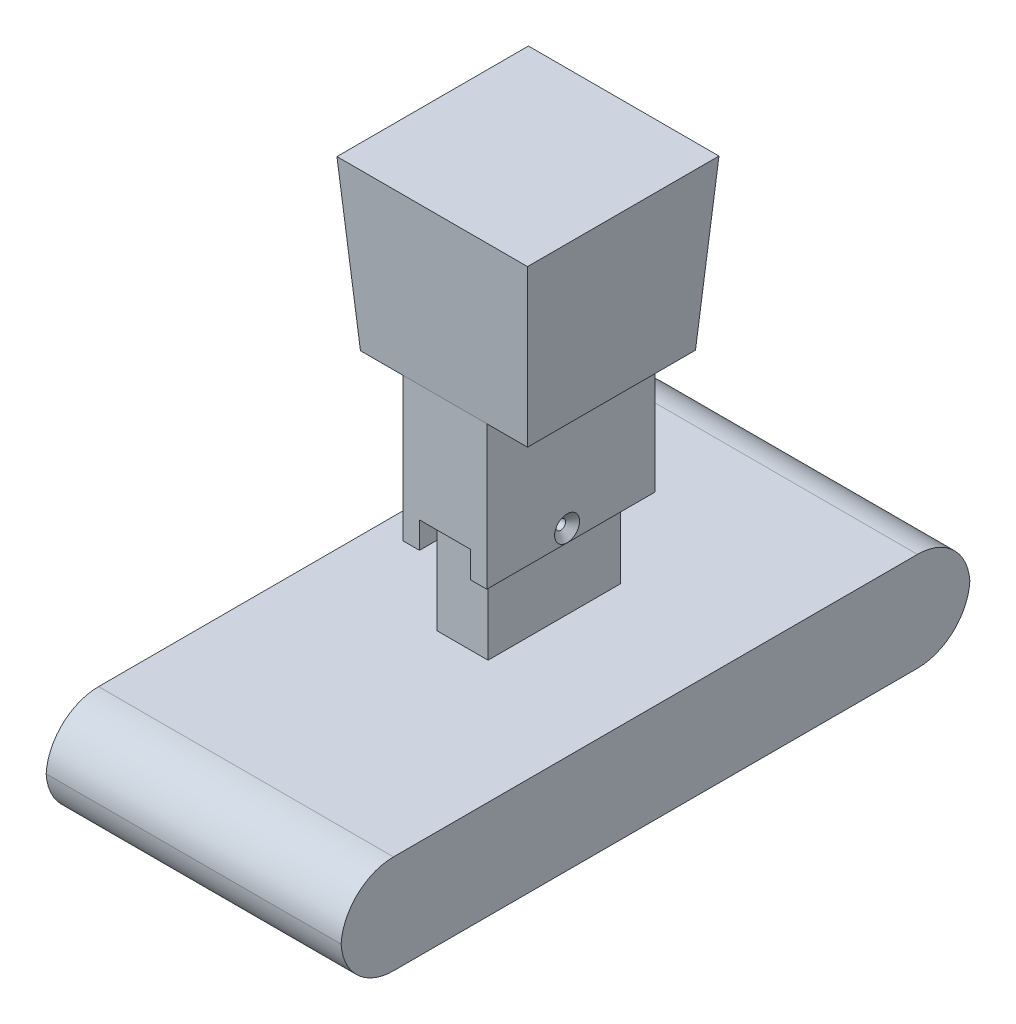
ISO-10303-21;
HEADER;
FILE_DESCRIPTION(('STEP AP214'),'2;1');
FILE_NAME('part.step','',(''),(''),'','','');
FILE_SCHEMA(('AUTOMOTIVE_DESIGN { 1 0 10303 214 1 1 1 1 }'));
ENDSEC;
DATA;
#1=APPLICATION_CONTEXT('core data for automotive mechanical design processes');
#2=APPLICATION_PROTOCOL_DEFINITION('international standard','automotive_design',2000,#1);
#3=PRODUCT_CONTEXT('',#1,'mechanical');
#4=PRODUCT('Part','Part','',(#3));
#5=PRODUCT_RELATED_PRODUCT_CATEGORY('part','',(#4));
#6=PRODUCT_DEFINITION_FORMATION('','',#4);
#7=PRODUCT_DEFINITION_CONTEXT('part definition',#1,'design');
#8=PRODUCT_DEFINITION('design','',#6,#7);
#9=PRODUCT_DEFINITION_SHAPE('','',#8);
#10=(LENGTH_UNIT() NAMED_UNIT(*) SI_UNIT(.MILLI.,.METRE.));
#11=(NAMED_UNIT(*) PLANE_ANGLE_UNIT() SI_UNIT($,.RADIAN.));
#12=(NAMED_UNIT(*) SI_UNIT($,.STERADIAN.) SOLID_ANGLE_UNIT());
#13=UNCERTAINTY_MEASURE_WITH_UNIT(LENGTH_MEASURE(1.E-05),#10,'distance_accuracy_value','');
#14=(GEOMETRIC_REPRESENTATION_CONTEXT(3) GLOBAL_UNCERTAINTY_ASSIGNED_CONTEXT((#13)) GLOBAL_UNIT_ASSIGNED_CONTEXT((#10,
#11,#12)) REPRESENTATION_CONTEXT('',''));
#15=CARTESIAN_POINT('',(0.,0.,0.));
#16=DIRECTION('',(0.,0.,1.));
#17=DIRECTION('',(1.,0.,0.));
#18=AXIS2_PLACEMENT_3D('',#15,#16,#17);
#19=CARTESIAN_POINT('',(-113.089384852017,0.,20.32));
#20=DIRECTION('',(-1.,0.,0.));
#21=DIRECTION('',(0.,0.,1.));
#22=AXIS2_PLACEMENT_3D('',#19,#20,#21);
#23=PLANE('',#22);
#24=DIRECTION('',(0.,1.,0.));
#25=VECTOR('',#24,1.);
#26=CARTESIAN_POINT('',(-113.089384852017,29.0032816792758,2.13819608356187));
#27=LINE('',#26,#25);
#28=CARTESIAN_POINT('',(-113.089384852017,38.5086381309477,2.13819608356187));
#29=VERTEX_POINT('',#28);
#30=CARTESIAN_POINT('',(-113.089384852017,41.7032816792758,2.13819608356187));
#31=VERTEX_POINT('',#30);
#32=EDGE_CURVE('E254',#29,#31,#27,.T.);
#33=ORIENTED_EDGE('',*,*,#32,.F.);
#34=DIRECTION('',(0.,0.,-1.));
#35=VECTOR('',#34,1.);
#36=CARTESIAN_POINT('',(-113.089384852017,38.5086381309477,20.32));
#37=LINE('',#36,#35);
#38=CARTESIAN_POINT('',(-113.089384852017,38.5086381309477,0.));
#39=VERTEX_POINT('',#38);
#40=EDGE_CURVE('E282',#29,#39,#37,.T.);
#41=ORIENTED_EDGE('',*,*,#40,.T.);
#42=DIRECTION('',(0.,1.,0.));
#43=VECTOR('',#42,1.);
#44=CARTESIAN_POINT('',(-113.089384852017,0.,0.));
#45=LINE('',#44,#43);
#46=CARTESIAN_POINT('',(-113.089384852017,41.7032816792758,0.));
#47=VERTEX_POINT('',#46);
#48=EDGE_CURVE('E261',#39,#47,#45,.T.);
#49=ORIENTED_EDGE('',*,*,#48,.T.);
#50=DIRECTION('',(0.,0.,-1.));
#51=VECTOR('',#50,1.);
#52=CARTESIAN_POINT('',(-113.089384852017,41.7032816792758,20.32));
#53=LINE('',#52,#51);
#54=EDGE_CURVE('E271',#31,#47,#53,.T.);
#55=ORIENTED_EDGE('',*,*,#54,.F.);
#56=EDGE_LOOP('',(#33,#41,#49,#55));
#57=FACE_BOUND('',#56,.T.);
#58=ADVANCED_FACE('F36',(#57),#23,.F.);
#59=DIRECTION('',(0.,1.,0.));
#60=VECTOR('',#59,1.);
#61=CARTESIAN_POINT('',(-113.089384852017,29.0032816792758,18.1771981960504));
#62=LINE('',#61,#60);
#63=CARTESIAN_POINT('',(-113.089384852017,38.5086381309477,18.1771981960504));
#64=VERTEX_POINT('',#63);
#65=CARTESIAN_POINT('',(-113.089384852017,41.7032816792758,18.1771981960504));
#66=VERTEX_POINT('',#65);
#67=EDGE_CURVE('E233',#64,#66,#62,.T.);
#68=ORIENTED_EDGE('',*,*,#67,.T.);
#69=CARTESIAN_POINT('',(-113.089384852017,41.7032816792758,20.32));
#70=VERTEX_POINT('',#69);
#71=EDGE_CURVE('E284',#70,#66,#53,.T.);
#72=ORIENTED_EDGE('',*,*,#71,.F.);
#73=DIRECTION('',(0.,1.,0.));
#74=VECTOR('',#73,1.);
#75=CARTESIAN_POINT('',(-113.089384852017,0.,20.32));
#76=LINE('',#75,#74);
#77=CARTESIAN_POINT('',(-113.089384852017,38.5086381309477,20.32));
#78=VERTEX_POINT('',#77);
#79=EDGE_CURVE('E262',#78,#70,#76,.T.);
#80=ORIENTED_EDGE('',*,*,#79,.F.);
#81=EDGE_CURVE('E286',#78,#64,#37,.T.);
#82=ORIENTED_EDGE('',*,*,#81,.T.);
#83=EDGE_LOOP('',(#68,#72,#80,#82));
#84=FACE_BOUND('',#83,.T.);
#85=ADVANCED_FACE('F432',(#84),#23,.F.);
#86=CARTESIAN_POINT('',(-106.938297537199,0.,20.32));
#87=DIRECTION('',(-1.,0.,0.));
#88=DIRECTION('',(0.,0.,1.));
#89=AXIS2_PLACEMENT_3D('',#86,#87,#88);
#90=PLANE('',#89);
#91=DIRECTION('',(0.,0.,-1.));
#92=VECTOR('',#91,1.);
#93=CARTESIAN_POINT('',(-106.938297537199,38.5086381309477,20.32));
#94=LINE('',#93,#92);
#95=CARTESIAN_POINT('',(-106.938297537199,38.5086381309477,2.13819608356187));
#96=VERTEX_POINT('',#95);
#97=CARTESIAN_POINT('',(-106.938297537199,38.5086381309477,0.));
#98=VERTEX_POINT('',#97);
#99=EDGE_CURVE('E289',#96,#98,#94,.T.);
#100=ORIENTED_EDGE('',*,*,#99,.F.);
#101=DIRECTION('',(0.,1.,0.));
#102=VECTOR('',#101,1.);
#103=CARTESIAN_POINT('',(-106.938297537199,29.0032816792758,2.13819608356187));
#104=LINE('',#103,#102);
#105=CARTESIAN_POINT('',(-106.938297537199,41.7032816792758,2.13819608356187));
#106=VERTEX_POINT('',#105);
#107=EDGE_CURVE('E250',#96,#106,#104,.T.);
#108=ORIENTED_EDGE('',*,*,#107,.T.);
#109=DIRECTION('',(0.,0.,-1.));
#110=VECTOR('',#109,1.);
#111=CARTESIAN_POINT('',(-106.938297537199,41.7032816792758,20.32));
#112=LINE('',#111,#110);
#113=CARTESIAN_POINT('',(-106.938297537199,41.7032816792758,0.));
#114=VERTEX_POINT('',#113);
#115=EDGE_CURVE('E283',#106,#114,#112,.T.);
#116=ORIENTED_EDGE('',*,*,#115,.T.);
#117=DIRECTION('',(0.,1.,0.));
#118=VECTOR('',#117,1.);
#119=CARTESIAN_POINT('',(-106.938297537199,0.,0.));
#120=LINE('',#119,#118);
#121=EDGE_CURVE('E266',#98,#114,#120,.T.);
#122=ORIENTED_EDGE('',*,*,#121,.F.);
#123=EDGE_LOOP('',(#100,#108,#116,#122));
#124=FACE_BOUND('',#123,.T.);
#125=ADVANCED_FACE('F438',(#124),#90,.T.);
#126=CARTESIAN_POINT('',(-106.938297537199,41.7032816792758,20.32));
#127=VERTEX_POINT('',#126);
#128=CARTESIAN_POINT('',(-106.938297537199,41.7032816792758,18.1771981960504));
#129=VERTEX_POINT('',#128);
#130=EDGE_CURVE('E279',#127,#129,#112,.T.);
#131=ORIENTED_EDGE('',*,*,#130,.T.);
#132=DIRECTION('',(0.,1.,0.));
#133=VECTOR('',#132,1.);
#134=CARTESIAN_POINT('',(-106.938297537199,29.0032816792758,18.1771981960504));
#135=LINE('',#134,#133);
#136=CARTESIAN_POINT('',(-106.938297537199,38.5086381309477,18.1771981960504));
#137=VERTEX_POINT('',#136);
#138=EDGE_CURVE('E234',#137,#129,#135,.T.);
#139=ORIENTED_EDGE('',*,*,#138,.F.);
#140=CARTESIAN_POINT('',(-106.938297537199,38.5086381309477,20.32));
#141=VERTEX_POINT('',#140);
#142=EDGE_CURVE('E290',#141,#137,#94,.T.);
#143=ORIENTED_EDGE('',*,*,#142,.F.);
#144=DIRECTION('',(0.,1.,0.));
#145=VECTOR('',#144,1.);
#146=CARTESIAN_POINT('',(-106.938297537199,0.,20.32));
#147=LINE('',#146,#145);
#148=EDGE_CURVE('E269',#141,#127,#147,.T.);
#149=ORIENTED_EDGE('',*,*,#148,.T.);
#150=EDGE_LOOP('',(#131,#139,#143,#149));
#151=FACE_BOUND('',#150,.T.);
#152=ADVANCED_FACE('F677',(#151),#90,.T.);
#153=CARTESIAN_POINT('',(0.,41.7032816792758,20.32));
#154=DIRECTION('',(0.,1.,0.));
#155=DIRECTION('',(0.,0.,1.));
#156=AXIS2_PLACEMENT_3D('',#153,#154,#155);
#157=PLANE('',#156);
#158=DIRECTION('',(1.,0.,0.));
#159=VECTOR('',#158,1.);
#160=CARTESIAN_POINT('',(-113.089384852017,41.7032816792758,2.13819608356187));
#161=LINE('',#160,#159);
#162=EDGE_CURVE('E243',#31,#106,#161,.T.);
#163=ORIENTED_EDGE('',*,*,#162,.F.);
#164=ORIENTED_EDGE('',*,*,#54,.T.);
#165=DIRECTION('',(1.,0.,0.));
#166=VECTOR('',#165,1.);
#167=CARTESIAN_POINT('',(0.,41.7032816792758,0.));
#168=LINE('',#167,#166);
#169=EDGE_CURVE('E274',#47,#114,#168,.T.);
#170=ORIENTED_EDGE('',*,*,#169,.T.);
#171=ORIENTED_EDGE('',*,*,#115,.F.);
#172=EDGE_LOOP('',(#163,#164,#170,#171));
#173=FACE_BOUND('',#172,.T.);
#174=ADVANCED_FACE('F442',(#173),#157,.F.);
#175=DIRECTION('',(-1.,0.,0.));
#176=VECTOR('',#175,1.);
#177=CARTESIAN_POINT('',(-113.089384852017,41.7032816792758,18.1771981960504));
#178=LINE('',#177,#176);
#179=EDGE_CURVE('E222',#129,#66,#178,.T.);
#180=ORIENTED_EDGE('',*,*,#179,.F.);
#181=ORIENTED_EDGE('',*,*,#130,.F.);
#182=DIRECTION('',(1.,0.,0.));
#183=VECTOR('',#182,1.);
#184=CARTESIAN_POINT('',(0.,41.7032816792758,20.32));
#185=LINE('',#184,#183);
#186=EDGE_CURVE('E265',#70,#127,#185,.T.);
#187=ORIENTED_EDGE('',*,*,#186,.F.);
#188=ORIENTED_EDGE('',*,*,#71,.T.);
#189=EDGE_LOOP('',(#180,#181,#187,#188));
#190=FACE_BOUND('',#189,.T.);
#191=ADVANCED_FACE('F697',(#190),#157,.F.);
#192=CARTESIAN_POINT('',(-115.084414581043,38.5086381309477,20.32));
#193=DIRECTION('',(0.,1.,0.));
#194=DIRECTION('',(0.,0.,1.));
#195=AXIS2_PLACEMENT_3D('',#192,#193,#194);
#196=PLANE('',#195);
#197=DIRECTION('',(0.,0.,-1.));
#198=VECTOR('',#197,1.);
#199=CARTESIAN_POINT('',(-115.084414581043,38.5086381309477,20.32));
#200=LINE('',#199,#198);
#201=CARTESIAN_POINT('',(-115.084414581043,38.5086381309477,20.32));
#202=VERTEX_POINT('',#201);
#203=CARTESIAN_POINT('',(-115.084414581043,38.5086381309477,10.8353240301669));
#204=VERTEX_POINT('',#203);
#205=EDGE_CURVE('E326',#202,#204,#200,.T.);
#206=ORIENTED_EDGE('',*,*,#205,.T.);
#207=CARTESIAN_POINT('',(-116.579904861221,38.5086381309477,7.67563087085336));
#208=CARTESIAN_POINT('',(-116.531676430921,38.5086381309477,7.74013298126552));
#209=CARTESIAN_POINT('',(-116.483654495705,38.5086381309477,7.80478861527027));
#210=CARTESIAN_POINT('',(-116.388113526813,38.5086381309477,7.93447560651209));
#211=CARTESIAN_POINT('',(-116.340594520505,38.5086381309477,7.99950698390219));
#212=CARTESIAN_POINT('',(-116.19871613225,38.5086381309477,8.19555912378945));
#213=CARTESIAN_POINT('',(-116.105259373255,38.5086381309477,8.32724008149249));
#214=CARTESIAN_POINT('',(-115.965625203916,38.5086381309477,8.52990545343885));
#215=CARTESIAN_POINT('',(-115.918105690399,38.5086381309477,8.59996458844611));
#216=CARTESIAN_POINT('',(-115.824380850821,38.5086381309477,8.74095484776935));
#217=CARTESIAN_POINT('',(-115.778175462128,38.5086381309477,8.81188593029636));
#218=CARTESIAN_POINT('',(-115.687509967517,38.5086381309477,8.95476904816014));
#219=CARTESIAN_POINT('',(-115.643048313018,38.5086381309477,9.02672009663571));
#220=CARTESIAN_POINT('',(-115.556388565981,38.5086381309477,9.17196700307332));
#221=CARTESIAN_POINT('',(-115.514190134147,38.5086381309477,9.24526265723319));
#222=CARTESIAN_POINT('',(-115.433558611727,38.5086381309477,9.39224553137101));
#223=CARTESIAN_POINT('',(-115.395072542976,38.5086381309477,9.4659034418633));
#224=CARTESIAN_POINT('',(-115.3221174564,38.5086381309477,9.61525373900121));
#225=CARTESIAN_POINT('',(-115.287650321112,38.5086381309477,9.69094705880034));
#226=CARTESIAN_POINT('',(-115.224658464418,38.5086381309477,9.84377501740627));
#227=CARTESIAN_POINT('',(-115.196069378831,38.5086381309477,9.92088270803192));
#228=CARTESIAN_POINT('',(-115.146346947675,38.5086381309477,10.0774300876217));
#229=CARTESIAN_POINT('',(-115.125202030043,38.5086381309477,10.1568659472885));
#230=CARTESIAN_POINT('',(-115.10199891339,38.5086381309477,10.2709456209364));
#231=CARTESIAN_POINT('',(-115.095988765363,38.5086381309477,10.3048014618216));
#232=CARTESIAN_POINT('',(-115.085776234085,38.5086381309477,10.3728235600691));
#233=CARTESIAN_POINT('',(-115.081575768524,38.5086381309477,10.4069901077385));
#234=CARTESIAN_POINT('',(-115.073546466467,38.5086381309477,10.4920066641473));
#235=CARTESIAN_POINT('',(-115.070869720658,38.5086381309477,10.5429710584947));
#236=CARTESIAN_POINT('',(-115.069916584298,38.5086381309477,10.6449548681138));
#237=CARTESIAN_POINT('',(-115.071641647297,38.5086381309477,10.6959742959978));
#238=CARTESIAN_POINT('',(-115.079394285956,38.5086381309477,10.7977520469518));
#239=CARTESIAN_POINT('',(-115.085427807555,38.5086381309477,10.8485099114359));
#240=CARTESIAN_POINT('',(-115.10146203058,38.5086381309477,10.9493859653943));
#241=CARTESIAN_POINT('',(-115.1114630687,38.5086381309477,10.9995041002067));
#242=CARTESIAN_POINT('',(-115.142180502623,38.5086381309477,11.1294947105796));
#243=CARTESIAN_POINT('',(-115.165703897389,38.5086381309477,11.2087040792724));
#244=CARTESIAN_POINT('',(-115.219656313533,38.5086381309477,11.3647288228605));
#245=CARTESIAN_POINT('',(-115.250091536832,38.5086381309477,11.4415419768171));
#246=CARTESIAN_POINT('',(-115.316399833669,38.5086381309477,11.5938965101818));
#247=CARTESIAN_POINT('',(-115.352336046426,38.5086381309477,11.6694100438383));
#248=CARTESIAN_POINT('',(-115.409031096902,38.5086381309477,11.7812211922712));
#249=CARTESIAN_POINT('',(-115.428391141939,38.5086381309477,11.8182423904664));
#250=CARTESIAN_POINT('',(-115.467914847167,38.5086381309477,11.8918518174995));
#251=CARTESIAN_POINT('',(-115.488078469607,38.5086381309477,11.9284400665723));
#252=CARTESIAN_POINT('',(-115.559720943907,38.5086381309477,12.0556015744904));
#253=CARTESIAN_POINT('',(-115.6129830929,38.5086381309477,12.1451703266226));
#254=CARTESIAN_POINT('',(-115.722453272709,38.5086381309477,12.3224964311492));
#255=CARTESIAN_POINT('',(-115.778662031617,38.5086381309477,12.4102533283054));
#256=CARTESIAN_POINT('',(-115.893232128843,38.5086381309477,12.5844380401989));
#257=CARTESIAN_POINT('',(-115.951595018128,38.5086381309477,12.6708648312253));
#258=CARTESIAN_POINT('',(-116.069885000815,38.5086381309477,12.8426436038981));
#259=CARTESIAN_POINT('',(-116.129812181147,38.5086381309477,12.9279955254195));
#260=CARTESIAN_POINT('',(-116.311720466465,38.5086381309477,13.1833346103282));
#261=CARTESIAN_POINT('',(-116.435464577521,38.5086381309477,13.352063616011));
#262=CARTESIAN_POINT('',(-116.685714681425,38.5086381309477,13.6873264620036));
#263=CARTESIAN_POINT('',(-116.812219429261,38.5086381309477,13.8538612396748));
#264=CARTESIAN_POINT('',(-117.052245136166,38.5086381309477,14.1661888061546));
#265=CARTESIAN_POINT('',(-117.16556233834,38.5086381309477,14.3121384264933));
#266=CARTESIAN_POINT('',(-117.393251945514,38.5086381309477,14.6032422070764));
#267=CARTESIAN_POINT('',(-117.507624489307,38.5086381309477,14.7483962585721));
#268=CARTESIAN_POINT('',(-117.73643951923,38.5086381309477,15.037216045746));
#269=CARTESIAN_POINT('',(-117.850877359793,38.5086381309477,15.1808854660023));
#270=CARTESIAN_POINT('',(-118.080322965854,38.5086381309477,15.4677319198929));
#271=CARTESIAN_POINT('',(-118.195330639647,38.5086381309477,15.610909026852));
#272=CARTESIAN_POINT('',(-118.310547202255,38.5086381309477,15.7539166762153));
#273=B_SPLINE_CURVE_WITH_KNOTS('',3,(#207,#208,#209,#210,#211,#212,#213,#214,#215,#216,#217,
#218,#219,#220,#221,#222,#223,#224,#225,#226,#227,#228,#229,#230,#231,#232,#233,#234,#235,#236,
#237,#238,#239,#240,#241,#242,#243,#244,#245,#246,#247,#248,#249,#250,#251,#252,#253,#254,#255,
#256,#257,#258,#259,#260,#261,#262,#263,#264,#265,#266,#267,#268,#269,#270,#271,#272),
.UNSPECIFIED.,.F.,.F.,(4,2,2,2,2,2,2,2,2,2,2,2,2,2,2,2,2,2,2,2,2,2,2,2,2,2,2,2,2,2,2,2,4),(0.,
0.241614223093022,0.483241527755067,0.967613970145048,1.22156686795779,1.47550764190726,
1.72921753817881,1.98288929221179,2.23212090787343,2.48146880276117,2.72792086401175,
2.97398810267858,3.07710217067755,3.18032523978585,3.3332339924325,3.4861932446048,
3.63936399891521,3.79254775445141,4.03996878679196,4.28761271116376,4.53834803349285,
4.66367431335579,4.78899471245659,5.10152526717679,5.41413341406338,5.72697120504148,
6.03982641816922,6.66749296228431,7.29488205881656,7.84920261605751,8.40359714427429,
8.9546238476804,9.50556458026913),.UNSPECIFIED.);
#274=CARTESIAN_POINT('',(-115.084414581043,38.5086381309477,10.3858569711352));
#275=VERTEX_POINT('',#274);
#276=EDGE_CURVE('E347',#204,#275,#273,.F.);
#277=ORIENTED_EDGE('',*,*,#276,.T.);
#278=CARTESIAN_POINT('',(-115.084414581043,38.5086381309477,0.));
#279=VERTEX_POINT('',#278);
#280=EDGE_CURVE('E325',#275,#279,#200,.T.);
#281=ORIENTED_EDGE('',*,*,#280,.T.);
#282=DIRECTION('',(1.,0.,0.));
#283=VECTOR('',#282,1.);
#284=CARTESIAN_POINT('',(-115.084414581043,38.5086381309477,0.));
#285=LINE('',#284,#283);
#286=EDGE_CURVE('E310',#279,#39,#285,.T.);
#287=ORIENTED_EDGE('',*,*,#286,.T.);
#288=ORIENTED_EDGE('',*,*,#40,.F.);
#289=DIRECTION('',(0.,0.,-1.));
#290=VECTOR('',#289,1.);
#291=CARTESIAN_POINT('',(-113.089384852017,38.5086381309477,20.32));
#292=LINE('',#291,#290);
#293=EDGE_CURVE('E259',#64,#29,#292,.T.);
#294=ORIENTED_EDGE('',*,*,#293,.F.);
#295=ORIENTED_EDGE('',*,*,#81,.F.);
#296=DIRECTION('',(1.,0.,0.));
#297=VECTOR('',#296,1.);
#298=CARTESIAN_POINT('',(-115.084414581043,38.5086381309477,20.32));
#299=LINE('',#298,#297);
#300=EDGE_CURVE('E299',#202,#78,#299,.T.);
#301=ORIENTED_EDGE('',*,*,#300,.F.);
#302=EDGE_LOOP('',(#206,#277,#281,#287,#288,#294,#295,#301));
#303=FACE_BOUND('',#302,.T.);
#304=ADVANCED_FACE('F385',(#303),#196,.F.);
#305=CARTESIAN_POINT('',(-120.233861276357,55.8496868393301,20.32));
#306=DIRECTION('',(0.,1.,0.));
#307=DIRECTION('',(0.,0.,1.));
#308=AXIS2_PLACEMENT_3D('',#305,#306,#307);
#309=PLANE('',#308);
#310=DIRECTION('',(0.,0.,-1.));
#311=VECTOR('',#310,1.);
#312=CARTESIAN_POINT('',(-115.084414581043,55.8496868393301,20.32));
#313=LINE('',#312,#311);
#314=CARTESIAN_POINT('',(-115.084414581043,55.8496868393301,20.32));
#315=VERTEX_POINT('',#314);
#316=CARTESIAN_POINT('',(-115.084414581043,55.8496868393301,0.));
#317=VERTEX_POINT('',#316);
#318=EDGE_CURVE('E306',#315,#317,#313,.T.);
#319=ORIENTED_EDGE('',*,*,#318,.F.);
#320=DIRECTION('',(1.,0.,0.));
#321=VECTOR('',#320,1.);
#322=CARTESIAN_POINT('',(-120.233861276357,55.8496868393301,20.32));
#323=LINE('',#322,#321);
#324=CARTESIAN_POINT('',(-120.233861276357,55.8496868393301,20.32));
#325=VERTEX_POINT('',#324);
#326=EDGE_CURVE('E330',#325,#315,#323,.T.);
#327=ORIENTED_EDGE('',*,*,#326,.F.);
#328=DIRECTION('',(0.,0.,-1.));
#329=VECTOR('',#328,1.);
#330=CARTESIAN_POINT('',(-120.233861276357,55.8496868393301,20.32));
#331=LINE('',#330,#329);
#332=CARTESIAN_POINT('',(-120.233861276357,55.8496868393301,0.));
#333=VERTEX_POINT('',#332);
#334=EDGE_CURVE('E343',#325,#333,#331,.T.);
#335=ORIENTED_EDGE('',*,*,#334,.T.);
#336=DIRECTION('',(1.,0.,0.));
#337=VECTOR('',#336,1.);
#338=CARTESIAN_POINT('',(-120.233861276357,55.8496868393301,0.));
#339=LINE('',#338,#337);
#340=EDGE_CURVE('E335',#333,#317,#339,.T.);
#341=ORIENTED_EDGE('',*,*,#340,.T.);
#342=EDGE_LOOP('',(#319,#327,#335,#341));
#343=FACE_BOUND('',#342,.T.);
#344=ADVANCED_FACE('F402',(#343),#309,.F.);
#345=CARTESIAN_POINT('',(-120.233861276357,55.8496868393301,20.32));
#346=DIRECTION('',(-0.997564050259824,-0.0697564737441255,0.));
#347=DIRECTION('',(0.0697564737441255,-0.997564050259824,0.));
#348=AXIS2_PLACEMENT_3D('',#345,#346,#347);
#349=PLANE('',#348);
#350=DIRECTION('',(0.0695873743166648,-0.995145815783508,0.0695873743166648));
#351=VECTOR('',#350,1.);
#352=CARTESIAN_POINT('',(-120.135463654219,54.4425352846759,0.0983976221383236));
#353=LINE('',#352,#351);
#354=CARTESIAN_POINT('',(-121.656607466477,76.1959052722401,-1.42274619011969));
#355=VERTEX_POINT('',#354);
#356=EDGE_CURVE('E329',#355,#333,#353,.T.);
#357=ORIENTED_EDGE('',*,*,#356,.T.);
#358=ORIENTED_EDGE('',*,*,#334,.F.);
#359=DIRECTION('',(-0.0695873743166648,0.995145815783508,0.0695873743166648));
#360=VECTOR('',#359,1.);
#361=CARTESIAN_POINT('',(-120.233861276357,55.8496868393301,20.32));
#362=LINE('',#361,#360);
#363=CARTESIAN_POINT('',(-121.656607466477,76.1959052722401,21.7427461901197));
#364=VERTEX_POINT('',#363);
#365=EDGE_CURVE('E350',#364,#325,#362,.F.);
#366=ORIENTED_EDGE('',*,*,#365,.F.);
#367=DIRECTION('',(0.,0.,1.));
#368=VECTOR('',#367,1.);
#369=CARTESIAN_POINT('',(-121.656607466477,76.1959052722401,20.32));
#370=LINE('',#369,#368);
#371=EDGE_CURVE('E354',#364,#355,#370,.F.);
#372=ORIENTED_EDGE('',*,*,#371,.T.);
#373=EDGE_LOOP('',(#357,#358,#366,#372));
#374=FACE_BOUND('',#373,.T.);
#375=ADVANCED_FACE('F400',(#374),#349,.T.);
#376=CARTESIAN_POINT('',(-104.950246136138,55.8496868393301,20.32));
#377=VERTEX_POINT('',#376);
#378=CARTESIAN_POINT('',(-100.024194645011,55.8496868393301,20.32));
#379=VERTEX_POINT('',#378);
#380=EDGE_CURVE('E334',#377,#379,#323,.T.);
#381=ORIENTED_EDGE('',*,*,#380,.F.);
#382=DIRECTION('',(0.,0.,-1.));
#383=VECTOR('',#382,1.);
#384=CARTESIAN_POINT('',(-104.950246136138,55.8496868393301,20.32));
#385=LINE('',#384,#383);
#386=CARTESIAN_POINT('',(-104.950246136138,55.8496868393301,0.));
#387=VERTEX_POINT('',#386);
#388=EDGE_CURVE('E319',#377,#387,#385,.T.);
#389=ORIENTED_EDGE('',*,*,#388,.T.);
#390=CARTESIAN_POINT('',(-100.024194645011,55.8496868393301,0.));
#391=VERTEX_POINT('',#390);
#392=EDGE_CURVE('E339',#387,#391,#339,.T.);
#393=ORIENTED_EDGE('',*,*,#392,.T.);
#394=DIRECTION('',(0.,0.,-1.));
#395=VECTOR('',#394,1.);
#396=CARTESIAN_POINT('',(-100.024194645011,55.8496868393301,20.32));
#397=LINE('',#396,#395);
#398=EDGE_CURVE('E340',#379,#391,#397,.T.);
#399=ORIENTED_EDGE('',*,*,#398,.F.);
#400=EDGE_LOOP('',(#381,#389,#393,#399));
#401=FACE_BOUND('',#400,.T.);
#402=ADVANCED_FACE('F397',(#401),#309,.F.);
#403=CARTESIAN_POINT('',(-100.024194645011,55.8496868393301,20.32));
#404=DIRECTION('',(0.997564050259824,-0.0697564737441255,0.));
#405=DIRECTION('',(0.0697564737441255,0.997564050259824,0.));
#406=AXIS2_PLACEMENT_3D('',#403,#404,#405);
#407=PLANE('',#406);
#408=DIRECTION('',(0.0695873743166648,0.995145815783508,-0.0695873743166648));
#409=VECTOR('',#408,1.);
#410=CARTESIAN_POINT('',(-100.122592267149,54.4425352846759,0.0983976221383236));
#411=LINE('',#410,#409);
#412=CARTESIAN_POINT('',(-98.6014484548909,76.1959052722401,-1.42274619011969));
#413=VERTEX_POINT('',#412);
#414=EDGE_CURVE('E338',#391,#413,#411,.T.);
#415=ORIENTED_EDGE('',*,*,#414,.T.);
#416=DIRECTION('',(0.,0.,1.));
#417=VECTOR('',#416,1.);
#418=CARTESIAN_POINT('',(-98.6014484548909,76.1959052722401,20.32));
#419=LINE('',#418,#417);
#420=CARTESIAN_POINT('',(-98.6014484548909,76.1959052722401,21.7427461901197));
#421=VERTEX_POINT('',#420);
#422=EDGE_CURVE('E344',#421,#413,#419,.F.);
#423=ORIENTED_EDGE('',*,*,#422,.F.);
#424=DIRECTION('',(-0.0695873743166648,-0.995145815783508,-0.0695873743166648));
#425=VECTOR('',#424,1.);
#426=CARTESIAN_POINT('',(-100.024194645011,55.8496868393301,20.32));
#427=LINE('',#426,#425);
#428=EDGE_CURVE('E333',#379,#421,#427,.F.);
#429=ORIENTED_EDGE('',*,*,#428,.F.);
#430=ORIENTED_EDGE('',*,*,#398,.T.);
#431=EDGE_LOOP('',(#415,#423,#429,#430));
#432=FACE_BOUND('',#431,.T.);
#433=ADVANCED_FACE('F395',(#432),#407,.T.);
#434=CARTESIAN_POINT('',(-120.233861276357,76.1959052722401,20.32));
#435=DIRECTION('',(0.,-1.,0.));
#436=DIRECTION('',(0.,0.,-1.));
#437=AXIS2_PLACEMENT_3D('',#434,#435,#436);
#438=PLANE('',#437);
#439=DIRECTION('',(1.,0.,0.));
#440=VECTOR('',#439,1.);
#441=CARTESIAN_POINT('',(-120.233861276357,76.1959052722401,-1.42274619011969));
#442=LINE('',#441,#440);
#443=EDGE_CURVE('E353',#413,#355,#442,.F.);
#444=ORIENTED_EDGE('',*,*,#443,.T.);
#445=ORIENTED_EDGE('',*,*,#371,.F.);
#446=DIRECTION('',(-1.,0.,0.));
#447=VECTOR('',#446,1.);
#448=CARTESIAN_POINT('',(-120.233861276357,76.1959052722401,21.7427461901197));
#449=LINE('',#448,#447);
#450=EDGE_CURVE('E349',#421,#364,#449,.T.);
#451=ORIENTED_EDGE('',*,*,#450,.F.);
#452=ORIENTED_EDGE('',*,*,#422,.T.);
#453=EDGE_LOOP('',(#444,#445,#451,#452));
#454=FACE_BOUND('',#453,.T.);
#455=ADVANCED_FACE('F391',(#454),#438,.F.);
#456=CARTESIAN_POINT('',(-120.233861276357,55.8496868393301,20.32));
#457=DIRECTION('',(0.,-0.0697564737441255,0.997564050259824));
#458=DIRECTION('',(0.,-0.997564050259824,-0.0697564737441255));
#459=AXIS2_PLACEMENT_3D('',#456,#457,#458);
#460=PLANE('',#459);
#461=ORIENTED_EDGE('',*,*,#365,.T.);
#462=ORIENTED_EDGE('',*,*,#326,.T.);
#463=DIRECTION('',(-1.,0.,0.));
#464=VECTOR('',#463,1.);
#465=CARTESIAN_POINT('',(-115.084414581043,55.8496868393301,20.32));
#466=LINE('',#465,#464);
#467=EDGE_CURVE('E304',#377,#315,#466,.T.);
#468=ORIENTED_EDGE('',*,*,#467,.F.);
#469=ORIENTED_EDGE('',*,*,#380,.T.);
#470=ORIENTED_EDGE('',*,*,#428,.T.);
#471=ORIENTED_EDGE('',*,*,#450,.T.);
#472=EDGE_LOOP('',(#461,#462,#468,#469,#470,#471));
#473=FACE_BOUND('',#472,.T.);
#474=ADVANCED_FACE('F394',(#473),#460,.T.);
#475=CARTESIAN_POINT('',(-120.233861276357,55.8496868393301,0.));
#476=DIRECTION('',(0.,-0.0697564737441255,-0.997564050259824));
#477=DIRECTION('',(0.,0.997564050259824,-0.0697564737441255));
#478=AXIS2_PLACEMENT_3D('',#475,#476,#477);
#479=PLANE('',#478);
#480=ORIENTED_EDGE('',*,*,#356,.F.);
#481=ORIENTED_EDGE('',*,*,#443,.F.);
#482=ORIENTED_EDGE('',*,*,#414,.F.);
#483=ORIENTED_EDGE('',*,*,#392,.F.);
#484=DIRECTION('',(-1.,0.,0.));
#485=VECTOR('',#484,1.);
#486=CARTESIAN_POINT('',(-115.084414581043,55.8496868393301,0.));
#487=LINE('',#486,#485);
#488=EDGE_CURVE('E298',#387,#317,#487,.T.);
#489=ORIENTED_EDGE('',*,*,#488,.T.);
#490=ORIENTED_EDGE('',*,*,#340,.F.);
#491=EDGE_LOOP('',(#480,#481,#482,#483,#489,#490));
#492=FACE_BOUND('',#491,.T.);
#493=ADVANCED_FACE('F389',(#492),#479,.T.);
#494=CARTESIAN_POINT('',(-115.084414581043,55.8496868393301,20.32));
#495=DIRECTION('',(1.,0.,0.));
#496=DIRECTION('',(0.,0.,-1.));
#497=AXIS2_PLACEMENT_3D('',#494,#495,#496);
#498=PLANE('',#497);
#499=ORIENTED_EDGE('',*,*,#280,.F.);
#500=CARTESIAN_POINT('',(-115.084414581043,40.0031355483798,10.610590500651));
#501=DIRECTION('',(-1.,0.,0.));
#502=DIRECTION('',(0.,0.,1.));
#503=AXIS2_PLACEMENT_3D('',#500,#501,#502);
#504=CIRCLE('',#503,1.5113);
#505=EDGE_CURVE('E485',#204,#275,#504,.T.);
#506=ORIENTED_EDGE('',*,*,#505,.F.);
#507=ORIENTED_EDGE('',*,*,#205,.F.);
#508=DIRECTION('',(0.,-1.,0.));
#509=VECTOR('',#508,1.);
#510=CARTESIAN_POINT('',(-115.084414581043,55.8496868393301,20.32));
#511=LINE('',#510,#509);
#512=EDGE_CURVE('E294',#315,#202,#511,.T.);
#513=ORIENTED_EDGE('',*,*,#512,.F.);
#514=ORIENTED_EDGE('',*,*,#318,.T.);
#515=DIRECTION('',(0.,-1.,0.));
#516=VECTOR('',#515,1.);
#517=CARTESIAN_POINT('',(-115.084414581043,55.8496868393301,0.));
#518=LINE('',#517,#516);
#519=EDGE_CURVE('E293',#317,#279,#518,.T.);
#520=ORIENTED_EDGE('',*,*,#519,.T.);
#521=EDGE_LOOP('',(#499,#506,#507,#513,#514,#520));
#522=FACE_BOUND('',#521,.T.);
#523=ADVANCED_FACE('F383',(#522),#498,.F.);
#524=CARTESIAN_POINT('',(-104.950246136138,38.5086381309477,20.32));
#525=VERTEX_POINT('',#524);
#526=EDGE_CURVE('E297',#141,#525,#299,.T.);
#527=ORIENTED_EDGE('',*,*,#526,.F.);
#528=ORIENTED_EDGE('',*,*,#142,.T.);
#529=DIRECTION('',(0.,0.,1.));
#530=VECTOR('',#529,1.);
#531=CARTESIAN_POINT('',(-106.938297537199,38.5086381309477,20.32));
#532=LINE('',#531,#530);
#533=EDGE_CURVE('E256',#96,#137,#532,.T.);
#534=ORIENTED_EDGE('',*,*,#533,.F.);
#535=ORIENTED_EDGE('',*,*,#99,.T.);
#536=CARTESIAN_POINT('',(-104.950246136138,38.5086381309477,0.));
#537=VERTEX_POINT('',#536);
#538=EDGE_CURVE('E309',#98,#537,#285,.T.);
#539=ORIENTED_EDGE('',*,*,#538,.T.);
#540=DIRECTION('',(0.,0.,-1.));
#541=VECTOR('',#540,1.);
#542=CARTESIAN_POINT('',(-104.950246136138,38.5086381309477,20.32));
#543=LINE('',#542,#541);
#544=EDGE_CURVE('E322',#525,#537,#543,.T.);
#545=ORIENTED_EDGE('',*,*,#544,.F.);
#546=EDGE_LOOP('',(#527,#528,#534,#535,#539,#545));
#547=FACE_BOUND('',#546,.T.);
#548=ADVANCED_FACE('F377',(#547),#196,.F.);
#549=CARTESIAN_POINT('',(-104.950246136138,55.8496868393301,20.32));
#550=DIRECTION('',(-1.,0.,0.));
#551=DIRECTION('',(0.,0.,1.));
#552=AXIS2_PLACEMENT_3D('',#549,#550,#551);
#553=PLANE('',#552);
#554=CARTESIAN_POINT('',(-104.950246136138,40.0346896602054,10.6061995368957));
#555=DIRECTION('',(1.,0.,0.));
#556=DIRECTION('',(0.,0.,-1.));
#557=AXIS2_PLACEMENT_3D('',#554,#555,#556);
#558=CIRCLE('',#557,1.5113);
#559=CARTESIAN_POINT('',(-104.950246136138,40.0346896602054,9.09489953689566));
#560=VERTEX_POINT('',#559);
#561=EDGE_CURVE('E476',#560,#560,#558,.T.);
#562=ORIENTED_EDGE('',*,*,#561,.F.);
#563=EDGE_LOOP('',(#562));
#564=FACE_BOUND('',#563,.T.);
#565=DIRECTION('',(0.,1.,0.));
#566=VECTOR('',#565,1.);
#567=CARTESIAN_POINT('',(-104.950246136138,55.8496868393301,0.));
#568=LINE('',#567,#566);
#569=EDGE_CURVE('E313',#537,#387,#568,.T.);
#570=ORIENTED_EDGE('',*,*,#569,.T.);
#571=ORIENTED_EDGE('',*,*,#388,.F.);
#572=DIRECTION('',(0.,1.,0.));
#573=VECTOR('',#572,1.);
#574=CARTESIAN_POINT('',(-104.950246136138,55.8496868393301,20.32));
#575=LINE('',#574,#573);
#576=EDGE_CURVE('E302',#525,#377,#575,.T.);
#577=ORIENTED_EDGE('',*,*,#576,.F.);
#578=ORIENTED_EDGE('',*,*,#544,.T.);
#579=EDGE_LOOP('',(#570,#571,#577,#578));
#580=FACE_BOUND('',#579,.T.);
#581=ADVANCED_FACE('F382',(#564,#580),#553,.F.);
#582=CARTESIAN_POINT('',(0.,0.,20.32));
#583=DIRECTION('',(0.,0.,1.));
#584=DIRECTION('',(1.,0.,0.));
#585=AXIS2_PLACEMENT_3D('',#582,#583,#584);
#586=PLANE('',#585);
#587=ORIENTED_EDGE('',*,*,#79,.T.);
#588=ORIENTED_EDGE('',*,*,#186,.T.);
#589=ORIENTED_EDGE('',*,*,#148,.F.);
#590=ORIENTED_EDGE('',*,*,#526,.T.);
#591=ORIENTED_EDGE('',*,*,#576,.T.);
#592=ORIENTED_EDGE('',*,*,#467,.T.);
#593=ORIENTED_EDGE('',*,*,#512,.T.);
#594=ORIENTED_EDGE('',*,*,#300,.T.);
#595=EDGE_LOOP('',(#587,#588,#589,#590,#591,#592,#593,#594));
#596=FACE_BOUND('',#595,.T.);
#597=ADVANCED_FACE('F444',(#596),#586,.T.);
#598=CARTESIAN_POINT('',(0.,0.,0.));
#599=DIRECTION('',(0.,0.,1.));
#600=DIRECTION('',(1.,0.,0.));
#601=AXIS2_PLACEMENT_3D('',#598,#599,#600);
#602=PLANE('',#601);
#603=ORIENTED_EDGE('',*,*,#169,.F.);
#604=ORIENTED_EDGE('',*,*,#48,.F.);
#605=ORIENTED_EDGE('',*,*,#286,.F.);
#606=ORIENTED_EDGE('',*,*,#519,.F.);
#607=ORIENTED_EDGE('',*,*,#488,.F.);
#608=ORIENTED_EDGE('',*,*,#569,.F.);
#609=ORIENTED_EDGE('',*,*,#538,.F.);
#610=ORIENTED_EDGE('',*,*,#121,.T.);
#611=EDGE_LOOP('',(#603,#604,#605,#606,#607,#608,#609,#610));
#612=FACE_BOUND('',#611,.T.);
#613=ADVANCED_FACE('F446',(#612),#602,.F.);
#614=CARTESIAN_POINT('',(-113.089384852017,29.0032816792758,18.1771981960504));
#615=DIRECTION('',(1.,0.,0.));
#616=DIRECTION('',(0.,0.,-1.));
#617=AXIS2_PLACEMENT_3D('',#614,#615,#616);
#618=PLANE('',#617);
#619=CARTESIAN_POINT('',(-113.089384852017,29.0032816792758,18.1771981960504));
#620=VERTEX_POINT('',#619);
#621=EDGE_CURVE('E215',#620,#64,#62,.T.);
#622=ORIENTED_EDGE('',*,*,#621,.T.);
#623=ORIENTED_EDGE('',*,*,#293,.T.);
#624=CARTESIAN_POINT('',(-113.089384852017,29.0032816792758,2.13819608356187));
#625=VERTEX_POINT('',#624);
#626=EDGE_CURVE('E217',#625,#29,#27,.T.);
#627=ORIENTED_EDGE('',*,*,#626,.F.);
#628=DIRECTION('',(0.,0.,-1.));
#629=VECTOR('',#628,1.);
#630=CARTESIAN_POINT('',(-113.089384852017,29.0032816792758,18.1771981960504));
#631=LINE('',#630,#629);
#632=EDGE_CURVE('E211',#620,#625,#631,.T.);
#633=ORIENTED_EDGE('',*,*,#632,.F.);
#634=EDGE_LOOP('',(#622,#623,#627,#633));
#635=FACE_BOUND('',#634,.T.);
#636=ADVANCED_FACE('F213',(#635),#618,.F.);
#637=CARTESIAN_POINT('',(-106.938297537199,29.0032816792758,18.1771981960504));
#638=DIRECTION('',(-1.,0.,0.));
#639=DIRECTION('',(0.,0.,1.));
#640=AXIS2_PLACEMENT_3D('',#637,#638,#639);
#641=PLANE('',#640);
#642=CARTESIAN_POINT('',(-106.938297537199,29.0032816792758,2.13819608356187));
#643=VERTEX_POINT('',#642);
#644=EDGE_CURVE('E251',#643,#96,#104,.T.);
#645=ORIENTED_EDGE('',*,*,#644,.T.);
#646=ORIENTED_EDGE('',*,*,#533,.T.);
#647=CARTESIAN_POINT('',(-106.938297537199,29.0032816792758,18.1771981960504));
#648=VERTEX_POINT('',#647);
#649=EDGE_CURVE('E248',#648,#137,#135,.T.);
#650=ORIENTED_EDGE('',*,*,#649,.F.);
#651=DIRECTION('',(0.,0.,1.));
#652=VECTOR('',#651,1.);
#653=CARTESIAN_POINT('',(-106.938297537199,29.0032816792758,18.1771981960504));
#654=LINE('',#653,#652);
#655=EDGE_CURVE('E238',#643,#648,#654,.T.);
#656=ORIENTED_EDGE('',*,*,#655,.F.);
#657=EDGE_LOOP('',(#645,#646,#650,#656));
#658=FACE_BOUND('',#657,.T.);
#659=ADVANCED_FACE('F453',(#658),#641,.F.);
#660=CARTESIAN_POINT('',(-113.089384852017,29.0032816792758,2.13819608356187));
#661=DIRECTION('',(0.,0.,1.));
#662=DIRECTION('',(1.,0.,0.));
#663=AXIS2_PLACEMENT_3D('',#660,#661,#662);
#664=PLANE('',#663);
#665=ORIENTED_EDGE('',*,*,#162,.T.);
#666=ORIENTED_EDGE('',*,*,#107,.F.);
#667=ORIENTED_EDGE('',*,*,#644,.F.);
#668=DIRECTION('',(1.,0.,0.));
#669=VECTOR('',#668,1.);
#670=CARTESIAN_POINT('',(-113.089384852017,29.0032816792758,2.13819608356187));
#671=LINE('',#670,#669);
#672=EDGE_CURVE('E221',#625,#643,#671,.T.);
#673=ORIENTED_EDGE('',*,*,#672,.F.);
#674=ORIENTED_EDGE('',*,*,#626,.T.);
#675=ORIENTED_EDGE('',*,*,#32,.T.);
#676=EDGE_LOOP('',(#665,#666,#667,#673,#674,#675));
#677=FACE_BOUND('',#676,.T.);
#678=ADVANCED_FACE('F468',(#677),#664,.F.);
#679=CARTESIAN_POINT('',(-113.089384852017,29.0032816792758,18.1771981960504));
#680=DIRECTION('',(0.,0.,-1.));
#681=DIRECTION('',(-1.,0.,0.));
#682=AXIS2_PLACEMENT_3D('',#679,#680,#681);
#683=PLANE('',#682);
#684=ORIENTED_EDGE('',*,*,#179,.T.);
#685=ORIENTED_EDGE('',*,*,#67,.F.);
#686=ORIENTED_EDGE('',*,*,#621,.F.);
#687=DIRECTION('',(-1.,0.,0.));
#688=VECTOR('',#687,1.);
#689=CARTESIAN_POINT('',(-113.089384852017,29.0032816792758,18.1771981960504));
#690=LINE('',#689,#688);
#691=EDGE_CURVE('E230',#648,#620,#690,.T.);
#692=ORIENTED_EDGE('',*,*,#691,.F.);
#693=ORIENTED_EDGE('',*,*,#649,.T.);
#694=ORIENTED_EDGE('',*,*,#138,.T.);
#695=EDGE_LOOP('',(#684,#685,#686,#692,#693,#694));
#696=FACE_BOUND('',#695,.T.);
#697=ADVANCED_FACE('F228',(#696),#683,.F.);
#698=CARTESIAN_POINT('',(-108.950746136138,40.0346896602054,10.6061995368957));
#699=DIRECTION('',(1.,0.,0.));
#700=DIRECTION('',(0.,0.,-1.));
#701=AXIS2_PLACEMENT_3D('',#698,#699,#700);
#702=CONICAL_SURFACE('',#701,0.59563,1.02974425867666);
#703=CARTESIAN_POINT('',(-109.30863674665,40.0346896602054,10.6061995368957));
#704=VERTEX_POINT('',#703);
#705=VERTEX_LOOP('',#704);
#706=FACE_BOUND('',#705,.T.);
#707=CARTESIAN_POINT('',(-108.950746136138,40.0346896602054,10.6061995368957));
#708=DIRECTION('',(1.,0.,0.));
#709=DIRECTION('',(0.,0.,-1.));
#710=AXIS2_PLACEMENT_3D('',#707,#708,#709);
#711=CIRCLE('',#710,0.59563);
#712=CARTESIAN_POINT('',(-108.950746136138,40.0346896602054,10.0105695368957));
#713=VERTEX_POINT('',#712);
#714=EDGE_CURVE('E246',#713,#713,#711,.T.);
#715=ORIENTED_EDGE('',*,*,#714,.T.);
#716=EDGE_LOOP('',(#715));
#717=FACE_BOUND('',#716,.T.);
#718=ADVANCED_FACE('F617',(#706,#717),#702,.F.);
#719=CARTESIAN_POINT('',(-104.950246136138,40.0346896602054,10.6061995368957));
#720=DIRECTION('',(1.,0.,0.));
#721=DIRECTION('',(0.,0.,-1.));
#722=AXIS2_PLACEMENT_3D('',#719,#720,#721);
#723=CYLINDRICAL_SURFACE('',#722,0.59563);
#724=ORIENTED_EDGE('',*,*,#714,.F.);
#725=EDGE_LOOP('',(#724));
#726=FACE_BOUND('',#725,.T.);
#727=CARTESIAN_POINT('',(-105.718584495419,40.0346896602054,10.6061995368957));
#728=DIRECTION('',(1.,0.,0.));
#729=DIRECTION('',(0.,0.,-1.));
#730=AXIS2_PLACEMENT_3D('',#727,#728,#729);
#731=CIRCLE('',#730,0.59563);
#732=CARTESIAN_POINT('',(-105.718584495419,40.0346896602054,10.0105695368957));
#733=VERTEX_POINT('',#732);
#734=EDGE_CURVE('E473',#733,#733,#731,.T.);
#735=ORIENTED_EDGE('',*,*,#734,.T.);
#736=EDGE_LOOP('',(#735));
#737=FACE_BOUND('',#736,.T.);
#738=ADVANCED_FACE('F607',(#726,#737),#723,.F.);
#739=CARTESIAN_POINT('',(-104.950246136138,40.0346896602054,10.6061995368957));
#740=DIRECTION('',(1.,0.,0.));
#741=DIRECTION('',(0.,0.,-1.));
#742=AXIS2_PLACEMENT_3D('',#739,#740,#741);
#743=CONICAL_SURFACE('',#742,1.5113,0.872664625997166);
#744=ORIENTED_EDGE('',*,*,#734,.F.);
#745=EDGE_LOOP('',(#744));
#746=FACE_BOUND('',#745,.T.);
#747=ORIENTED_EDGE('',*,*,#561,.T.);
#748=EDGE_LOOP('',(#747));
#749=FACE_BOUND('',#748,.T.);
#750=ADVANCED_FACE('F598',(#746,#749),#743,.F.);
#751=CARTESIAN_POINT('',(-115.084414581043,40.0031355483798,10.610590500651));
#752=DIRECTION('',(-1.,0.,0.));
#753=DIRECTION('',(0.,0.,1.));
#754=AXIS2_PLACEMENT_3D('',#751,#752,#753);
#755=CONICAL_SURFACE('',#754,1.5113,0.872664625997164);
#756=CARTESIAN_POINT('',(-114.316076221763,40.0031355483798,10.610590500651));
#757=DIRECTION('',(-1.,0.,0.));
#758=DIRECTION('',(0.,0.,1.));
#759=AXIS2_PLACEMENT_3D('',#756,#757,#758);
#760=CIRCLE('',#759,0.595629999999986);
#761=CARTESIAN_POINT('',(-114.316076221763,40.0031355483798,11.206220500651));
#762=VERTEX_POINT('',#761);
#763=EDGE_CURVE('E482',#762,#762,#760,.T.);
#764=ORIENTED_EDGE('',*,*,#763,.F.);
#765=EDGE_LOOP('',(#764));
#766=FACE_BOUND('',#765,.T.);
#767=ORIENTED_EDGE('',*,*,#505,.T.);
#768=ORIENTED_EDGE('',*,*,#276,.F.);
#769=EDGE_LOOP('',(#767,#768));
#770=FACE_BOUND('',#769,.T.);
#771=ADVANCED_FACE('F373',(#766,#770),#755,.F.);
#772=CARTESIAN_POINT('',(-111.020414581043,40.0031355483798,10.610590500651));
#773=DIRECTION('',(-1.,0.,0.));
#774=DIRECTION('',(0.,0.,1.));
#775=AXIS2_PLACEMENT_3D('',#772,#773,#774);
#776=CONICAL_SURFACE('',#775,0.595629999999986,1.02974425867665);
#777=CARTESIAN_POINT('',(-110.662523970531,40.0031355483798,10.610590500651));
#778=VERTEX_POINT('',#777);
#779=VERTEX_LOOP('',#778);
#780=FACE_BOUND('',#779,.T.);
#781=CARTESIAN_POINT('',(-111.020414581043,40.0031355483798,10.610590500651));
#782=DIRECTION('',(-1.,0.,0.));
#783=DIRECTION('',(0.,0.,1.));
#784=AXIS2_PLACEMENT_3D('',#781,#782,#783);
#785=CIRCLE('',#784,0.595629999999986);
#786=CARTESIAN_POINT('',(-111.020414581043,40.0031355483798,11.206220500651));
#787=VERTEX_POINT('',#786);
#788=EDGE_CURVE('E479',#787,#787,#785,.T.);
#789=ORIENTED_EDGE('',*,*,#788,.T.);
#790=EDGE_LOOP('',(#789));
#791=FACE_BOUND('',#790,.T.);
#792=ADVANCED_FACE('F580',(#780,#791),#776,.F.);
#793=CARTESIAN_POINT('',(-115.084414581043,40.0031355483798,10.610590500651));
#794=DIRECTION('',(-1.,0.,0.));
#795=DIRECTION('',(0.,0.,1.));
#796=AXIS2_PLACEMENT_3D('',#793,#794,#795);
#797=CYLINDRICAL_SURFACE('',#796,0.595629999999986);
#798=ORIENTED_EDGE('',*,*,#788,.F.);
#799=EDGE_LOOP('',(#798));
#800=FACE_BOUND('',#799,.T.);
#801=ORIENTED_EDGE('',*,*,#763,.T.);
#802=EDGE_LOOP('',(#801));
#803=FACE_BOUND('',#802,.T.);
#804=ADVANCED_FACE('F526',(#800,#803),#797,.F.);
#805=CARTESIAN_POINT('',(0.,29.0032816792758,0.));
#806=DIRECTION('',(0.,-1.,0.));
#807=DIRECTION('',(0.,0.,-1.));
#808=AXIS2_PLACEMENT_3D('',#805,#806,#807);
#809=PLANE('',#808);
#810=DIRECTION('',(0.,0.,-1.));
#811=VECTOR('',#810,1.);
#812=CARTESIAN_POINT('',(-127.735273809763,29.0032816792758,-25.2337279240298));
#813=LINE('',#812,#811);
#814=CARTESIAN_POINT('',(-127.735273809763,29.0032816792758,44.5037665103655));
#815=VERTEX_POINT('',#814);
#816=CARTESIAN_POINT('',(-127.735273809763,29.0032816792758,-18.8837279240298));
#817=VERTEX_POINT('',#816);
#818=EDGE_CURVE('E488',#815,#817,#813,.T.);
#819=ORIENTED_EDGE('',*,*,#818,.F.);
#820=DIRECTION('',(-1.,0.,0.));
#821=VECTOR('',#820,1.);
#822=CARTESIAN_POINT('',(0.,29.0032816792758,44.5037665103655));
#823=LINE('',#822,#821);
#824=CARTESIAN_POINT('',(-92.052492569372,29.0032816792758,44.5037665103655));
#825=VERTEX_POINT('',#824);
#826=EDGE_CURVE('E11',#815,#825,#823,.F.);
#827=ORIENTED_EDGE('',*,*,#826,.T.);
#828=DIRECTION('',(0.,0.,1.));
#829=VECTOR('',#828,1.);
#830=CARTESIAN_POINT('',(-92.052492569372,29.0032816792758,-25.2337279240298));
#831=LINE('',#830,#829);
#832=CARTESIAN_POINT('',(-92.052492569372,29.0032816792758,-18.8837279240298));
#833=VERTEX_POINT('',#832);
#834=EDGE_CURVE('E491',#833,#825,#831,.T.);
#835=ORIENTED_EDGE('',*,*,#834,.F.);
#836=DIRECTION('',(1.,0.,0.));
#837=VECTOR('',#836,1.);
#838=CARTESIAN_POINT('',(0.,29.0032816792758,-18.8837279240298));
#839=LINE('',#838,#837);
#840=EDGE_CURVE('E507',#833,#817,#839,.F.);
#841=ORIENTED_EDGE('',*,*,#840,.T.);
#842=EDGE_LOOP('',(#819,#827,#835,#841));
#843=FACE_BOUND('',#842,.T.);
#844=ORIENTED_EDGE('',*,*,#632,.T.);
#845=ORIENTED_EDGE('',*,*,#672,.T.);
#846=ORIENTED_EDGE('',*,*,#655,.T.);
#847=ORIENTED_EDGE('',*,*,#691,.T.);
#848=EDGE_LOOP('',(#844,#845,#846,#847));
#849=FACE_BOUND('',#848,.T.);
#850=ADVANCED_FACE('F236',(#843,#849),#809,.F.);
#851=CARTESIAN_POINT('',(-92.052492569372,17.0652816792758,-25.2337279240298));
#852=DIRECTION('',(-1.,0.,0.));
#853=DIRECTION('',(0.,0.,1.));
#854=AXIS2_PLACEMENT_3D('',#851,#852,#853);
#855=PLANE('',#854);
#856=CARTESIAN_POINT('',(-92.052492569372,22.6532816792758,44.5037665103655));
#857=DIRECTION('',(-1.,0.,0.));
#858=DIRECTION('',(0.,0.,1.));
#859=AXIS2_PLACEMENT_3D('',#856,#857,#858);
#860=CIRCLE('',#859,6.35);
#861=CARTESIAN_POINT('',(-92.052492569372,23.0342816792758,50.8423262048071));
#862=VERTEX_POINT('',#861);
#863=EDGE_CURVE('E52',#825,#862,#860,.F.);
#864=ORIENTED_EDGE('',*,*,#863,.T.);
#865=CARTESIAN_POINT('',(-92.052492569372,23.4152816792758,44.5037665103655));
#866=DIRECTION('',(-1.,0.,0.));
#867=DIRECTION('',(0.,0.,1.));
#868=AXIS2_PLACEMENT_3D('',#865,#866,#867);
#869=CIRCLE('',#868,6.35);
#870=CARTESIAN_POINT('',(-92.052492569372,17.0652816792758,44.5037665103655));
#871=VERTEX_POINT('',#870);
#872=EDGE_CURVE('E45',#862,#871,#869,.F.);
#873=ORIENTED_EDGE('',*,*,#872,.T.);
#874=DIRECTION('',(0.,0.,1.));
#875=VECTOR('',#874,1.);
#876=CARTESIAN_POINT('',(-92.052492569372,17.0652816792758,-25.2337279240298));
#877=LINE('',#876,#875);
#878=CARTESIAN_POINT('',(-92.052492569372,17.0652816792758,-18.8837279240298));
#879=VERTEX_POINT('',#878);
#880=EDGE_CURVE('E490',#879,#871,#877,.T.);
#881=ORIENTED_EDGE('',*,*,#880,.F.);
#882=CARTESIAN_POINT('',(-92.052492569372,23.4152816792758,-18.8837279240298));
#883=DIRECTION('',(-1.,0.,0.));
#884=DIRECTION('',(0.,0.,1.));
#885=AXIS2_PLACEMENT_3D('',#882,#883,#884);
#886=CIRCLE('',#885,6.35);
#887=CARTESIAN_POINT('',(-92.052492569372,23.0342816792758,-25.2222876184714));
#888=VERTEX_POINT('',#887);
#889=EDGE_CURVE('E881',#879,#888,#886,.F.);
#890=ORIENTED_EDGE('',*,*,#889,.T.);
#891=CARTESIAN_POINT('',(-92.052492569372,22.6532816792758,-18.8837279240298));
#892=DIRECTION('',(-1.,0.,0.));
#893=DIRECTION('',(0.,0.,1.));
#894=AXIS2_PLACEMENT_3D('',#891,#892,#893);
#895=CIRCLE('',#894,6.35);
#896=EDGE_CURVE('E885',#888,#833,#895,.F.);
#897=ORIENTED_EDGE('',*,*,#896,.T.);
#898=ORIENTED_EDGE('',*,*,#834,.T.);
#899=EDGE_LOOP('',(#864,#873,#881,#890,#897,#898));
#900=FACE_BOUND('',#899,.T.);
#901=ADVANCED_FACE('F517',(#900),#855,.F.);
#902=CARTESIAN_POINT('',(-127.735273809763,17.0652816792758,-25.2337279240298));
#903=DIRECTION('',(1.,0.,0.));
#904=DIRECTION('',(0.,0.,-1.));
#905=AXIS2_PLACEMENT_3D('',#902,#903,#904);
#906=PLANE('',#905);
#907=DIRECTION('',(0.,0.,-1.));
#908=VECTOR('',#907,1.);
#909=CARTESIAN_POINT('',(-127.735273809763,17.0652816792758,-25.2337279240298));
#910=LINE('',#909,#908);
#911=CARTESIAN_POINT('',(-127.735273809763,17.0652816792758,44.5037665103655));
#912=VERTEX_POINT('',#911);
#913=CARTESIAN_POINT('',(-127.735273809763,17.0652816792758,-18.8837279240298));
#914=VERTEX_POINT('',#913);
#915=EDGE_CURVE('E487',#912,#914,#910,.T.);
#916=ORIENTED_EDGE('',*,*,#915,.F.);
#917=CARTESIAN_POINT('',(-127.735273809763,23.4152816792758,44.5037665103655));
#918=DIRECTION('',(1.,0.,0.));
#919=DIRECTION('',(0.,0.,-1.));
#920=AXIS2_PLACEMENT_3D('',#917,#918,#919);
#921=CIRCLE('',#920,6.35);
#922=CARTESIAN_POINT('',(-127.735273809763,23.0342816792758,50.8423262048071));
#923=VERTEX_POINT('',#922);
#924=EDGE_CURVE('E505',#912,#923,#921,.F.);
#925=ORIENTED_EDGE('',*,*,#924,.T.);
#926=CARTESIAN_POINT('',(-127.735273809763,22.6532816792758,44.5037665103655));
#927=DIRECTION('',(1.,0.,0.));
#928=DIRECTION('',(0.,0.,-1.));
#929=AXIS2_PLACEMENT_3D('',#926,#927,#928);
#930=CIRCLE('',#929,6.35);
#931=EDGE_CURVE('E506',#923,#815,#930,.F.);
#932=ORIENTED_EDGE('',*,*,#931,.T.);
#933=ORIENTED_EDGE('',*,*,#818,.T.);
#934=CARTESIAN_POINT('',(-127.735273809763,22.6532816792758,-18.8837279240298));
#935=DIRECTION('',(1.,0.,0.));
#936=DIRECTION('',(0.,0.,-1.));
#937=AXIS2_PLACEMENT_3D('',#934,#935,#936);
#938=CIRCLE('',#937,6.35);
#939=CARTESIAN_POINT('',(-127.735273809763,23.0342816792758,-25.2222876184714));
#940=VERTEX_POINT('',#939);
#941=EDGE_CURVE('E884',#817,#940,#938,.F.);
#942=ORIENTED_EDGE('',*,*,#941,.T.);
#943=CARTESIAN_POINT('',(-127.735273809763,23.4152816792758,-18.8837279240298));
#944=DIRECTION('',(1.,0.,0.));
#945=DIRECTION('',(0.,0.,-1.));
#946=AXIS2_PLACEMENT_3D('',#943,#944,#945);
#947=CIRCLE('',#946,6.35);
#948=EDGE_CURVE('E511',#940,#914,#947,.F.);
#949=ORIENTED_EDGE('',*,*,#948,.T.);
#950=EDGE_LOOP('',(#916,#925,#932,#933,#942,#949));
#951=FACE_BOUND('',#950,.T.);
#952=ADVANCED_FACE('F519',(#951),#906,.F.);
#953=CARTESIAN_POINT('',(0.,17.0652816792758,0.));
#954=DIRECTION('',(0.,-1.,0.));
#955=DIRECTION('',(0.,0.,-1.));
#956=AXIS2_PLACEMENT_3D('',#953,#954,#955);
#957=PLANE('',#956);
#958=ORIENTED_EDGE('',*,*,#880,.T.);
#959=DIRECTION('',(-1.,0.,0.));
#960=VECTOR('',#959,1.);
#961=CARTESIAN_POINT('',(-127.735273809763,17.0652816792758,44.5037665103655));
#962=LINE('',#961,#960);
#963=EDGE_CURVE('E501',#871,#912,#962,.T.);
#964=ORIENTED_EDGE('',*,*,#963,.T.);
#965=ORIENTED_EDGE('',*,*,#915,.T.);
#966=DIRECTION('',(1.,0.,0.));
#967=VECTOR('',#966,1.);
#968=CARTESIAN_POINT('',(-92.052492569372,17.0652816792758,-18.8837279240298));
#969=LINE('',#968,#967);
#970=EDGE_CURVE('E371',#914,#879,#969,.T.);
#971=ORIENTED_EDGE('',*,*,#970,.T.);
#972=EDGE_LOOP('',(#958,#964,#965,#971));
#973=FACE_BOUND('',#972,.T.);
#974=ADVANCED_FACE('F421',(#973),#957,.T.);
#975=CARTESIAN_POINT('',(-92.052492569372,22.6532816792758,-18.8837279240298));
#976=DIRECTION('',(1.,0.,0.));
#977=DIRECTION('',(0.,0.,-1.));
#978=AXIS2_PLACEMENT_3D('',#975,#976,#977);
#979=CYLINDRICAL_SURFACE('',#978,6.35);
#980=DIRECTION('',(1.,0.,0.));
#981=VECTOR('',#980,1.);
#982=CARTESIAN_POINT('',(-109.893883189567,23.0342816792758,-25.2222876184714));
#983=LINE('',#982,#981);
#984=EDGE_CURVE('E493',#940,#888,#983,.T.);
#985=ORIENTED_EDGE('',*,*,#984,.F.);
#986=ORIENTED_EDGE('',*,*,#941,.F.);
#987=ORIENTED_EDGE('',*,*,#840,.F.);
#988=ORIENTED_EDGE('',*,*,#896,.F.);
#989=EDGE_LOOP('',(#985,#986,#987,#988));
#990=FACE_BOUND('',#989,.T.);
#991=ADVANCED_FACE('F418',(#990),#979,.T.);
#992=CARTESIAN_POINT('',(0.,23.4152816792758,-18.8837279240298));
#993=DIRECTION('',(-1.,0.,0.));
#994=DIRECTION('',(0.,0.,1.));
#995=AXIS2_PLACEMENT_3D('',#992,#993,#994);
#996=CYLINDRICAL_SURFACE('',#995,6.35);
#997=ORIENTED_EDGE('',*,*,#948,.F.);
#998=ORIENTED_EDGE('',*,*,#984,.T.);
#999=ORIENTED_EDGE('',*,*,#889,.F.);
#1000=ORIENTED_EDGE('',*,*,#970,.F.);
#1001=EDGE_LOOP('',(#997,#998,#999,#1000));
#1002=FACE_BOUND('',#1001,.T.);
#1003=ADVANCED_FACE('F415',(#1002),#996,.T.);
#1004=CARTESIAN_POINT('',(-92.052492569372,22.6532816792758,44.5037665103655));
#1005=DIRECTION('',(-1.,0.,0.));
#1006=DIRECTION('',(0.,0.,1.));
#1007=AXIS2_PLACEMENT_3D('',#1004,#1005,#1006);
#1008=CYLINDRICAL_SURFACE('',#1007,6.35);
#1009=DIRECTION('',(-1.,0.,0.));
#1010=VECTOR('',#1009,1.);
#1011=CARTESIAN_POINT('',(-109.893883189567,23.0342816792758,50.8423262048071));
#1012=LINE('',#1011,#1010);
#1013=EDGE_CURVE('E40',#862,#923,#1012,.T.);
#1014=ORIENTED_EDGE('',*,*,#1013,.F.);
#1015=ORIENTED_EDGE('',*,*,#863,.F.);
#1016=ORIENTED_EDGE('',*,*,#826,.F.);
#1017=ORIENTED_EDGE('',*,*,#931,.F.);
#1018=EDGE_LOOP('',(#1014,#1015,#1016,#1017));
#1019=FACE_BOUND('',#1018,.T.);
#1020=ADVANCED_FACE('F38',(#1019),#1008,.T.);
#1021=CARTESIAN_POINT('',(0.,23.4152816792758,44.5037665103655));
#1022=DIRECTION('',(1.,0.,0.));
#1023=DIRECTION('',(0.,0.,-1.));
#1024=AXIS2_PLACEMENT_3D('',#1021,#1022,#1023);
#1025=CYLINDRICAL_SURFACE('',#1024,6.35);
#1026=ORIENTED_EDGE('',*,*,#872,.F.);
#1027=ORIENTED_EDGE('',*,*,#1013,.T.);
#1028=ORIENTED_EDGE('',*,*,#924,.F.);
#1029=ORIENTED_EDGE('',*,*,#963,.F.);
#1030=EDGE_LOOP('',(#1026,#1027,#1028,#1029));
#1031=FACE_BOUND('',#1030,.T.);
#1032=ADVANCED_FACE('F423',(#1031),#1025,.T.);
#1033=CLOSED_SHELL('',(#58,#85,#125,#152,#174,#191,#304,#344,#375,#402,#433,#455,#474,#493,#523,
#548,#581,#597,#613,#636,#659,#678,#697,#718,#738,#750,#771,#792,#804,#850,#901,#952,#974,#991,
#1003,#1020,#1032));
#1034=MANIFOLD_SOLID_BREP('B2',#1033);
#1035=ADVANCED_BREP_SHAPE_REPRESENTATION('',(#18,#1034),#14);
#1036=SHAPE_DEFINITION_REPRESENTATION(#9,#1035);
ENDSEC;
END-ISO-10303-21;
